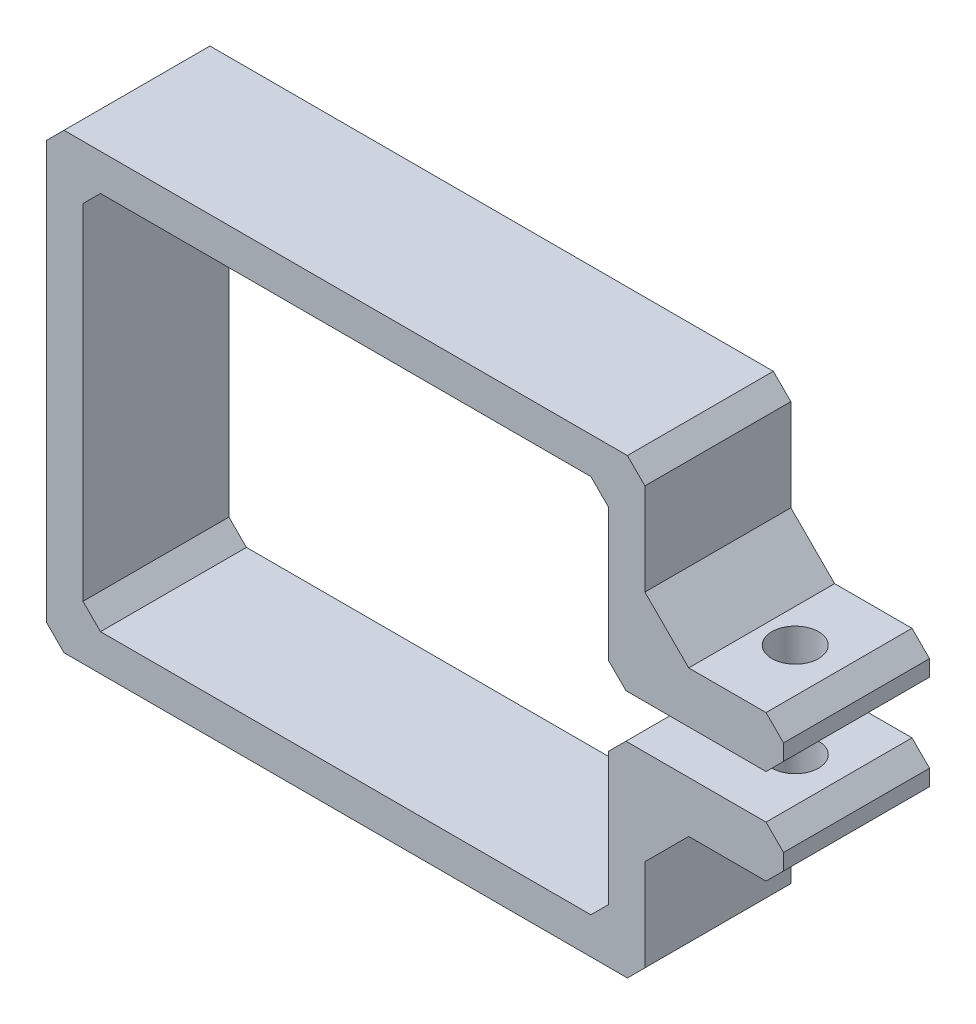
ISO-10303-21;
HEADER;
FILE_DESCRIPTION(('STEP AP214'),'2;1');
FILE_NAME('part.step','',(''),(''),'','','');
FILE_SCHEMA(('AUTOMOTIVE_DESIGN { 1 0 10303 214 1 1 1 1 }'));
ENDSEC;
DATA;
#1=APPLICATION_CONTEXT('core data for automotive mechanical design processes');
#2=APPLICATION_PROTOCOL_DEFINITION('international standard','automotive_design',2000,#1);
#3=PRODUCT_CONTEXT('',#1,'mechanical');
#4=PRODUCT('Part','Part','',(#3));
#5=PRODUCT_RELATED_PRODUCT_CATEGORY('part','',(#4));
#6=PRODUCT_DEFINITION_FORMATION('','',#4);
#7=PRODUCT_DEFINITION_CONTEXT('part definition',#1,'design');
#8=PRODUCT_DEFINITION('design','',#6,#7);
#9=PRODUCT_DEFINITION_SHAPE('','',#8);
#10=(LENGTH_UNIT() NAMED_UNIT(*) SI_UNIT(.MILLI.,.METRE.));
#11=(NAMED_UNIT(*) PLANE_ANGLE_UNIT() SI_UNIT($,.RADIAN.));
#12=(NAMED_UNIT(*) SI_UNIT($,.STERADIAN.) SOLID_ANGLE_UNIT());
#13=UNCERTAINTY_MEASURE_WITH_UNIT(LENGTH_MEASURE(1.E-05),#10,'distance_accuracy_value','');
#14=(GEOMETRIC_REPRESENTATION_CONTEXT(3) GLOBAL_UNCERTAINTY_ASSIGNED_CONTEXT((#13)) GLOBAL_UNIT_ASSIGNED_CONTEXT((#10,
#11,#12)) REPRESENTATION_CONTEXT('',''));
#15=CARTESIAN_POINT('',(0.,0.,0.));
#16=DIRECTION('',(0.,0.,1.));
#17=DIRECTION('',(1.,0.,0.));
#18=AXIS2_PLACEMENT_3D('',#15,#16,#17);
#19=CARTESIAN_POINT('',(0.,5.,10.));
#20=DIRECTION('',(0.,1.,0.));
#21=DIRECTION('',(-1.,0.,0.));
#22=AXIS2_PLACEMENT_3D('',#19,#20,#21);
#23=PLANE('',#22);
#24=CARTESIAN_POINT('',(25.8,5.,5.));
#25=DIRECTION('',(0.,1.,0.));
#26=DIRECTION('',(-1.,0.,0.));
#27=AXIS2_PLACEMENT_3D('',#24,#25,#26);
#28=CIRCLE('',#27,1.6);
#29=CARTESIAN_POINT('',(24.2,5.,5.));
#30=VERTEX_POINT('',#29);
#31=EDGE_CURVE('E516',#30,#30,#28,.T.);
#32=ORIENTED_EDGE('',*,*,#31,.F.);
#33=EDGE_LOOP('',(#32));
#34=FACE_BOUND('',#33,.T.);
#35=DIRECTION('',(1.,0.,0.));
#36=VECTOR('',#35,1.);
#37=CARTESIAN_POINT('',(0.,5.,10.));
#38=LINE('',#37,#36);
#39=CARTESIAN_POINT('',(23.5,5.,10.));
#40=VERTEX_POINT('',#39);
#41=CARTESIAN_POINT('',(28.8,5.,10.));
#42=VERTEX_POINT('',#41);
#43=EDGE_CURVE('E310',#40,#42,#38,.T.);
#44=ORIENTED_EDGE('',*,*,#43,.T.);
#45=DIRECTION('',(0.,0.,-1.));
#46=VECTOR('',#45,1.);
#47=CARTESIAN_POINT('',(28.8,5.,10.));
#48=LINE('',#47,#46);
#49=CARTESIAN_POINT('',(28.8,5.,0.));
#50=VERTEX_POINT('',#49);
#51=EDGE_CURVE('E384',#42,#50,#48,.T.);
#52=ORIENTED_EDGE('',*,*,#51,.T.);
#53=DIRECTION('',(1.,0.,0.));
#54=VECTOR('',#53,1.);
#55=CARTESIAN_POINT('',(0.,5.,0.));
#56=LINE('',#55,#54);
#57=CARTESIAN_POINT('',(23.5,5.,0.));
#58=VERTEX_POINT('',#57);
#59=EDGE_CURVE('E467',#58,#50,#56,.T.);
#60=ORIENTED_EDGE('',*,*,#59,.F.);
#61=DIRECTION('',(0.,0.,1.));
#62=VECTOR('',#61,1.);
#63=CARTESIAN_POINT('',(23.5,5.,10.));
#64=LINE('',#63,#62);
#65=EDGE_CURVE('E263',#58,#40,#64,.T.);
#66=ORIENTED_EDGE('',*,*,#65,.T.);
#67=EDGE_LOOP('',(#44,#52,#60,#66));
#68=FACE_BOUND('',#67,.T.);
#69=ADVANCED_FACE('F41',(#34,#68),#23,.T.);
#70=CARTESIAN_POINT('',(20.5,0.,10.));
#71=DIRECTION('',(1.,0.,0.));
#72=DIRECTION('',(0.,0.,-1.));
#73=AXIS2_PLACEMENT_3D('',#70,#71,#72);
#74=PLANE('',#73);
#75=DIRECTION('',(0.,-1.,0.));
#76=VECTOR('',#75,1.);
#77=CARTESIAN_POINT('',(20.5,0.,0.));
#78=LINE('',#77,#76);
#79=CARTESIAN_POINT('',(20.5,14.3,0.));
#80=VERTEX_POINT('',#79);
#81=CARTESIAN_POINT('',(20.5,8.00000000000003,0.));
#82=VERTEX_POINT('',#81);
#83=EDGE_CURVE('E286',#80,#82,#78,.T.);
#84=ORIENTED_EDGE('',*,*,#83,.F.);
#85=DIRECTION('',(0.,0.,1.));
#86=VECTOR('',#85,1.);
#87=CARTESIAN_POINT('',(20.5,14.3,10.));
#88=LINE('',#87,#86);
#89=CARTESIAN_POINT('',(20.5,14.3,10.));
#90=VERTEX_POINT('',#89);
#91=EDGE_CURVE('E392',#80,#90,#88,.T.);
#92=ORIENTED_EDGE('',*,*,#91,.T.);
#93=DIRECTION('',(0.,-1.,0.));
#94=VECTOR('',#93,1.);
#95=CARTESIAN_POINT('',(20.5,0.,10.));
#96=LINE('',#95,#94);
#97=CARTESIAN_POINT('',(20.5,8.00000000000003,10.));
#98=VERTEX_POINT('',#97);
#99=EDGE_CURVE('E498',#90,#98,#96,.T.);
#100=ORIENTED_EDGE('',*,*,#99,.T.);
#101=DIRECTION('',(0.,0.,-1.));
#102=VECTOR('',#101,1.);
#103=CARTESIAN_POINT('',(20.5,8.00000000000003,0.));
#104=LINE('',#103,#102);
#105=EDGE_CURVE('E313',#98,#82,#104,.T.);
#106=ORIENTED_EDGE('',*,*,#105,.T.);
#107=EDGE_LOOP('',(#84,#92,#100,#106));
#108=FACE_BOUND('',#107,.T.);
#109=ADVANCED_FACE('F543',(#108),#74,.T.);
#110=CARTESIAN_POINT('',(0.,15.5,10.));
#111=DIRECTION('',(0.,1.,0.));
#112=DIRECTION('',(0.,0.,1.));
#113=AXIS2_PLACEMENT_3D('',#110,#111,#112);
#114=PLANE('',#113);
#115=DIRECTION('',(1.,0.,0.));
#116=VECTOR('',#115,1.);
#117=CARTESIAN_POINT('',(0.,15.5,10.));
#118=LINE('',#117,#116);
#119=CARTESIAN_POINT('',(-19.3,15.5,10.));
#120=VERTEX_POINT('',#119);
#121=CARTESIAN_POINT('',(19.3,15.5,10.));
#122=VERTEX_POINT('',#121);
#123=EDGE_CURVE('E505',#120,#122,#118,.T.);
#124=ORIENTED_EDGE('',*,*,#123,.T.);
#125=DIRECTION('',(0.,0.,-1.));
#126=VECTOR('',#125,1.);
#127=CARTESIAN_POINT('',(19.3,15.5,10.));
#128=LINE('',#127,#126);
#129=CARTESIAN_POINT('',(19.3,15.5,0.));
#130=VERTEX_POINT('',#129);
#131=EDGE_CURVE('E389',#122,#130,#128,.T.);
#132=ORIENTED_EDGE('',*,*,#131,.T.);
#133=DIRECTION('',(1.,0.,0.));
#134=VECTOR('',#133,1.);
#135=CARTESIAN_POINT('',(0.,15.5,0.));
#136=LINE('',#135,#134);
#137=CARTESIAN_POINT('',(-19.3,15.5,0.));
#138=VERTEX_POINT('',#137);
#139=EDGE_CURVE('E471',#138,#130,#136,.T.);
#140=ORIENTED_EDGE('',*,*,#139,.F.);
#141=DIRECTION('',(0.,0.,1.));
#142=VECTOR('',#141,1.);
#143=CARTESIAN_POINT('',(-19.3,15.5,10.));
#144=LINE('',#143,#142);
#145=EDGE_CURVE('E387',#138,#120,#144,.T.);
#146=ORIENTED_EDGE('',*,*,#145,.T.);
#147=EDGE_LOOP('',(#124,#132,#140,#146));
#148=FACE_BOUND('',#147,.T.);
#149=ADVANCED_FACE('F549',(#148),#114,.T.);
#150=CARTESIAN_POINT('',(-20.5,0.,10.));
#151=DIRECTION('',(1.,0.,0.));
#152=DIRECTION('',(0.,1.,0.));
#153=AXIS2_PLACEMENT_3D('',#150,#151,#152);
#154=PLANE('',#153);
#155=DIRECTION('',(0.,-1.,0.));
#156=VECTOR('',#155,1.);
#157=CARTESIAN_POINT('',(-20.5,0.,0.));
#158=LINE('',#157,#156);
#159=CARTESIAN_POINT('',(-20.5,14.3,0.));
#160=VERTEX_POINT('',#159);
#161=CARTESIAN_POINT('',(-20.5,-14.3,0.));
#162=VERTEX_POINT('',#161);
#163=EDGE_CURVE('E473',#160,#162,#158,.T.);
#164=ORIENTED_EDGE('',*,*,#163,.T.);
#165=DIRECTION('',(0.,0.,1.));
#166=VECTOR('',#165,1.);
#167=CARTESIAN_POINT('',(-20.5,-14.3,10.));
#168=LINE('',#167,#166);
#169=CARTESIAN_POINT('',(-20.5,-14.3,10.));
#170=VERTEX_POINT('',#169);
#171=EDGE_CURVE('E405',#162,#170,#168,.T.);
#172=ORIENTED_EDGE('',*,*,#171,.T.);
#173=DIRECTION('',(0.,-1.,0.));
#174=VECTOR('',#173,1.);
#175=CARTESIAN_POINT('',(-20.5,0.,10.));
#176=LINE('',#175,#174);
#177=CARTESIAN_POINT('',(-20.5,14.3,10.));
#178=VERTEX_POINT('',#177);
#179=EDGE_CURVE('E501',#178,#170,#176,.T.);
#180=ORIENTED_EDGE('',*,*,#179,.F.);
#181=DIRECTION('',(0.,0.,-1.));
#182=VECTOR('',#181,1.);
#183=CARTESIAN_POINT('',(-20.5,14.3,0.));
#184=LINE('',#183,#182);
#185=EDGE_CURVE('E402',#178,#160,#184,.T.);
#186=ORIENTED_EDGE('',*,*,#185,.T.);
#187=EDGE_LOOP('',(#164,#172,#180,#186));
#188=FACE_BOUND('',#187,.T.);
#189=ADVANCED_FACE('F712',(#188),#154,.F.);
#190=CARTESIAN_POINT('',(0.,-15.5,10.));
#191=DIRECTION('',(0.,1.,0.));
#192=DIRECTION('',(0.,0.,1.));
#193=AXIS2_PLACEMENT_3D('',#190,#191,#192);
#194=PLANE('',#193);
#195=DIRECTION('',(1.,0.,0.));
#196=VECTOR('',#195,1.);
#197=CARTESIAN_POINT('',(0.,-15.5,0.));
#198=LINE('',#197,#196);
#199=CARTESIAN_POINT('',(-19.3,-15.5,0.));
#200=VERTEX_POINT('',#199);
#201=CARTESIAN_POINT('',(19.3,-15.5,0.));
#202=VERTEX_POINT('',#201);
#203=EDGE_CURVE('E284',#200,#202,#198,.T.);
#204=ORIENTED_EDGE('',*,*,#203,.T.);
#205=DIRECTION('',(0.,0.,1.));
#206=VECTOR('',#205,1.);
#207=CARTESIAN_POINT('',(19.3,-15.5,10.));
#208=LINE('',#207,#206);
#209=CARTESIAN_POINT('',(19.3,-15.5,10.));
#210=VERTEX_POINT('',#209);
#211=EDGE_CURVE('E400',#202,#210,#208,.T.);
#212=ORIENTED_EDGE('',*,*,#211,.T.);
#213=DIRECTION('',(1.,0.,0.));
#214=VECTOR('',#213,1.);
#215=CARTESIAN_POINT('',(0.,-15.5,10.));
#216=LINE('',#215,#214);
#217=CARTESIAN_POINT('',(-19.3,-15.5,10.));
#218=VERTEX_POINT('',#217);
#219=EDGE_CURVE('E494',#218,#210,#216,.T.);
#220=ORIENTED_EDGE('',*,*,#219,.F.);
#221=DIRECTION('',(0.,0.,-1.));
#222=VECTOR('',#221,1.);
#223=CARTESIAN_POINT('',(-19.3,-15.5,10.));
#224=LINE('',#223,#222);
#225=EDGE_CURVE('E397',#218,#200,#224,.T.);
#226=ORIENTED_EDGE('',*,*,#225,.T.);
#227=EDGE_LOOP('',(#204,#212,#220,#226));
#228=FACE_BOUND('',#227,.T.);
#229=ADVANCED_FACE('F482',(#228),#194,.F.);
#230=CARTESIAN_POINT('',(20.5,-7.99999999999999,10.));
#231=VERTEX_POINT('',#230);
#232=CARTESIAN_POINT('',(20.5,-14.3,10.));
#233=VERTEX_POINT('',#232);
#234=EDGE_CURVE('E493',#231,#233,#96,.T.);
#235=ORIENTED_EDGE('',*,*,#234,.T.);
#236=DIRECTION('',(0.,0.,-1.));
#237=VECTOR('',#236,1.);
#238=CARTESIAN_POINT('',(20.5,-14.3,0.));
#239=LINE('',#238,#237);
#240=CARTESIAN_POINT('',(20.5,-14.3,0.));
#241=VERTEX_POINT('',#240);
#242=EDGE_CURVE('E394',#233,#241,#239,.T.);
#243=ORIENTED_EDGE('',*,*,#242,.T.);
#244=CARTESIAN_POINT('',(20.5,-7.99999999999999,0.));
#245=VERTEX_POINT('',#244);
#246=EDGE_CURVE('E280',#245,#241,#78,.T.);
#247=ORIENTED_EDGE('',*,*,#246,.F.);
#248=DIRECTION('',(0.,0.,1.));
#249=VECTOR('',#248,1.);
#250=CARTESIAN_POINT('',(20.5,-7.99999999999999,10.));
#251=LINE('',#250,#249);
#252=EDGE_CURVE('E257',#245,#231,#251,.T.);
#253=ORIENTED_EDGE('',*,*,#252,.T.);
#254=EDGE_LOOP('',(#235,#243,#247,#253));
#255=FACE_BOUND('',#254,.T.);
#256=ADVANCED_FACE('F496',(#255),#74,.T.);
#257=CARTESIAN_POINT('',(0.,-5.,10.));
#258=DIRECTION('',(0.,1.,0.));
#259=DIRECTION('',(0.,0.,1.));
#260=AXIS2_PLACEMENT_3D('',#257,#258,#259);
#261=PLANE('',#260);
#262=CARTESIAN_POINT('',(25.8,-5.,5.));
#263=DIRECTION('',(0.,1.,0.));
#264=DIRECTION('',(-1.,0.,0.));
#265=AXIS2_PLACEMENT_3D('',#262,#263,#264);
#266=CIRCLE('',#265,1.6);
#267=CARTESIAN_POINT('',(24.2,-5.,5.));
#268=VERTEX_POINT('',#267);
#269=EDGE_CURVE('E519',#268,#268,#266,.T.);
#270=ORIENTED_EDGE('',*,*,#269,.T.);
#271=EDGE_LOOP('',(#270));
#272=FACE_BOUND('',#271,.T.);
#273=DIRECTION('',(1.,0.,0.));
#274=VECTOR('',#273,1.);
#275=CARTESIAN_POINT('',(0.,-5.,0.));
#276=LINE('',#275,#274);
#277=CARTESIAN_POINT('',(23.5,-5.,0.));
#278=VERTEX_POINT('',#277);
#279=CARTESIAN_POINT('',(28.8,-5.,0.));
#280=VERTEX_POINT('',#279);
#281=EDGE_CURVE('E269',#278,#280,#276,.T.);
#282=ORIENTED_EDGE('',*,*,#281,.T.);
#283=DIRECTION('',(0.,0.,1.));
#284=VECTOR('',#283,1.);
#285=CARTESIAN_POINT('',(28.8,-5.,10.));
#286=LINE('',#285,#284);
#287=CARTESIAN_POINT('',(28.8,-5.,10.));
#288=VERTEX_POINT('',#287);
#289=EDGE_CURVE('E382',#280,#288,#286,.T.);
#290=ORIENTED_EDGE('',*,*,#289,.T.);
#291=DIRECTION('',(1.,0.,0.));
#292=VECTOR('',#291,1.);
#293=CARTESIAN_POINT('',(0.,-5.,10.));
#294=LINE('',#293,#292);
#295=CARTESIAN_POINT('',(23.5,-5.,10.));
#296=VERTEX_POINT('',#295);
#297=EDGE_CURVE('E272',#296,#288,#294,.T.);
#298=ORIENTED_EDGE('',*,*,#297,.F.);
#299=DIRECTION('',(0.,0.,-1.));
#300=VECTOR('',#299,1.);
#301=CARTESIAN_POINT('',(23.5,-5.,10.));
#302=LINE('',#301,#300);
#303=EDGE_CURVE('E256',#296,#278,#302,.T.);
#304=ORIENTED_EDGE('',*,*,#303,.T.);
#305=EDGE_LOOP('',(#282,#290,#298,#304));
#306=FACE_BOUND('',#305,.T.);
#307=ADVANCED_FACE('F268',(#272,#306),#261,.F.);
#308=CARTESIAN_POINT('',(30.,0.,10.));
#309=DIRECTION('',(1.,0.,0.));
#310=DIRECTION('',(0.,0.,-1.));
#311=AXIS2_PLACEMENT_3D('',#308,#309,#310);
#312=PLANE('',#311);
#313=DIRECTION('',(0.,-1.,0.));
#314=VECTOR('',#313,1.);
#315=CARTESIAN_POINT('',(30.,0.,0.));
#316=LINE('',#315,#314);
#317=CARTESIAN_POINT('',(30.,-2.7,0.));
#318=VERTEX_POINT('',#317);
#319=CARTESIAN_POINT('',(30.,-3.80000000000001,0.));
#320=VERTEX_POINT('',#319);
#321=EDGE_CURVE('E279',#318,#320,#316,.T.);
#322=ORIENTED_EDGE('',*,*,#321,.F.);
#323=DIRECTION('',(0.,0.,1.));
#324=VECTOR('',#323,1.);
#325=CARTESIAN_POINT('',(30.,-2.7,10.));
#326=LINE('',#325,#324);
#327=CARTESIAN_POINT('',(30.,-2.7,10.));
#328=VERTEX_POINT('',#327);
#329=EDGE_CURVE('E380',#318,#328,#326,.T.);
#330=ORIENTED_EDGE('',*,*,#329,.T.);
#331=DIRECTION('',(0.,-1.,0.));
#332=VECTOR('',#331,1.);
#333=CARTESIAN_POINT('',(30.,0.,10.));
#334=LINE('',#333,#332);
#335=CARTESIAN_POINT('',(30.,-3.80000000000001,10.));
#336=VERTEX_POINT('',#335);
#337=EDGE_CURVE('E499',#328,#336,#334,.T.);
#338=ORIENTED_EDGE('',*,*,#337,.T.);
#339=DIRECTION('',(0.,0.,-1.));
#340=VECTOR('',#339,1.);
#341=CARTESIAN_POINT('',(30.,-3.80000000000001,0.));
#342=LINE('',#341,#340);
#343=EDGE_CURVE('E377',#336,#320,#342,.T.);
#344=ORIENTED_EDGE('',*,*,#343,.T.);
#345=EDGE_LOOP('',(#322,#330,#338,#344));
#346=FACE_BOUND('',#345,.T.);
#347=ADVANCED_FACE('F696',(#346),#312,.T.);
#348=CARTESIAN_POINT('',(0.,-1.5,10.));
#349=DIRECTION('',(0.,1.,0.));
#350=DIRECTION('',(0.,0.,1.));
#351=AXIS2_PLACEMENT_3D('',#348,#349,#350);
#352=PLANE('',#351);
#353=CARTESIAN_POINT('',(25.8,-1.5,5.));
#354=DIRECTION('',(0.,1.,0.));
#355=DIRECTION('',(0.,0.,1.));
#356=AXIS2_PLACEMENT_3D('',#353,#354,#355);
#357=CIRCLE('',#356,1.6);
#358=CARTESIAN_POINT('',(25.8,-1.5,6.6));
#359=VERTEX_POINT('',#358);
#360=EDGE_CURVE('E469',#359,#359,#357,.T.);
#361=ORIENTED_EDGE('',*,*,#360,.F.);
#362=EDGE_LOOP('',(#361));
#363=FACE_BOUND('',#362,.T.);
#364=DIRECTION('',(1.,0.,0.));
#365=VECTOR('',#364,1.);
#366=CARTESIAN_POINT('',(0.,-1.5,10.));
#367=LINE('',#366,#365);
#368=CARTESIAN_POINT('',(19.2,-1.5,10.));
#369=VERTEX_POINT('',#368);
#370=CARTESIAN_POINT('',(28.8,-1.5,10.));
#371=VERTEX_POINT('',#370);
#372=EDGE_CURVE('E662',#369,#371,#367,.T.);
#373=ORIENTED_EDGE('',*,*,#372,.T.);
#374=DIRECTION('',(0.,0.,-1.));
#375=VECTOR('',#374,1.);
#376=CARTESIAN_POINT('',(28.8,-1.5,10.));
#377=LINE('',#376,#375);
#378=CARTESIAN_POINT('',(28.8,-1.5,0.));
#379=VERTEX_POINT('',#378);
#380=EDGE_CURVE('E374',#371,#379,#377,.T.);
#381=ORIENTED_EDGE('',*,*,#380,.T.);
#382=DIRECTION('',(1.,0.,0.));
#383=VECTOR('',#382,1.);
#384=CARTESIAN_POINT('',(0.,-1.5,0.));
#385=LINE('',#384,#383);
#386=CARTESIAN_POINT('',(19.2,-1.5,0.));
#387=VERTEX_POINT('',#386);
#388=EDGE_CURVE('E282',#387,#379,#385,.T.);
#389=ORIENTED_EDGE('',*,*,#388,.F.);
#390=DIRECTION('',(0.,0.,1.));
#391=VECTOR('',#390,1.);
#392=CARTESIAN_POINT('',(19.2,-1.5,10.));
#393=LINE('',#392,#391);
#394=EDGE_CURVE('E372',#387,#369,#393,.T.);
#395=ORIENTED_EDGE('',*,*,#394,.T.);
#396=EDGE_LOOP('',(#373,#381,#389,#395));
#397=FACE_BOUND('',#396,.T.);
#398=ADVANCED_FACE('F690',(#363,#397),#352,.T.);
#399=CARTESIAN_POINT('',(18.,0.,10.));
#400=DIRECTION('',(1.,0.,0.));
#401=DIRECTION('',(0.,0.,-1.));
#402=AXIS2_PLACEMENT_3D('',#399,#400,#401);
#403=PLANE('',#402);
#404=DIRECTION('',(0.,-1.,0.));
#405=VECTOR('',#404,1.);
#406=CARTESIAN_POINT('',(18.,0.,0.));
#407=LINE('',#406,#405);
#408=CARTESIAN_POINT('',(18.,-2.69999999999999,0.));
#409=VERTEX_POINT('',#408);
#410=CARTESIAN_POINT('',(18.,-11.8,0.));
#411=VERTEX_POINT('',#410);
#412=EDGE_CURVE('E292',#409,#411,#407,.T.);
#413=ORIENTED_EDGE('',*,*,#412,.T.);
#414=DIRECTION('',(0.,0.,1.));
#415=VECTOR('',#414,1.);
#416=CARTESIAN_POINT('',(18.,-11.8,10.));
#417=LINE('',#416,#415);
#418=CARTESIAN_POINT('',(18.,-11.8,10.));
#419=VERTEX_POINT('',#418);
#420=EDGE_CURVE('E415',#411,#419,#417,.T.);
#421=ORIENTED_EDGE('',*,*,#420,.T.);
#422=DIRECTION('',(0.,-1.,0.));
#423=VECTOR('',#422,1.);
#424=CARTESIAN_POINT('',(18.,0.,10.));
#425=LINE('',#424,#423);
#426=CARTESIAN_POINT('',(18.,-2.69999999999999,10.));
#427=VERTEX_POINT('',#426);
#428=EDGE_CURVE('E659',#427,#419,#425,.T.);
#429=ORIENTED_EDGE('',*,*,#428,.F.);
#430=DIRECTION('',(0.,0.,-1.));
#431=VECTOR('',#430,1.);
#432=CARTESIAN_POINT('',(18.,-2.69999999999999,0.));
#433=LINE('',#432,#431);
#434=EDGE_CURVE('E412',#427,#409,#433,.T.);
#435=ORIENTED_EDGE('',*,*,#434,.T.);
#436=EDGE_LOOP('',(#413,#421,#429,#435));
#437=FACE_BOUND('',#436,.T.);
#438=ADVANCED_FACE('F664',(#437),#403,.F.);
#439=CARTESIAN_POINT('',(0.,-13.,10.));
#440=DIRECTION('',(0.,1.,0.));
#441=DIRECTION('',(0.,0.,1.));
#442=AXIS2_PLACEMENT_3D('',#439,#440,#441);
#443=PLANE('',#442);
#444=DIRECTION('',(1.,0.,0.));
#445=VECTOR('',#444,1.);
#446=CARTESIAN_POINT('',(0.,-13.,10.));
#447=LINE('',#446,#445);
#448=CARTESIAN_POINT('',(-16.8,-13.,10.));
#449=VERTEX_POINT('',#448);
#450=CARTESIAN_POINT('',(16.8,-13.,10.));
#451=VERTEX_POINT('',#450);
#452=EDGE_CURVE('E667',#449,#451,#447,.T.);
#453=ORIENTED_EDGE('',*,*,#452,.T.);
#454=DIRECTION('',(0.,0.,-1.));
#455=VECTOR('',#454,1.);
#456=CARTESIAN_POINT('',(16.8,-13.,10.));
#457=LINE('',#456,#455);
#458=CARTESIAN_POINT('',(16.8,-13.,0.));
#459=VERTEX_POINT('',#458);
#460=EDGE_CURVE('E409',#451,#459,#457,.T.);
#461=ORIENTED_EDGE('',*,*,#460,.T.);
#462=DIRECTION('',(1.,0.,0.));
#463=VECTOR('',#462,1.);
#464=CARTESIAN_POINT('',(0.,-13.,0.));
#465=LINE('',#464,#463);
#466=CARTESIAN_POINT('',(-16.8,-13.,0.));
#467=VERTEX_POINT('',#466);
#468=EDGE_CURVE('E295',#467,#459,#465,.T.);
#469=ORIENTED_EDGE('',*,*,#468,.F.);
#470=DIRECTION('',(0.,0.,1.));
#471=VECTOR('',#470,1.);
#472=CARTESIAN_POINT('',(-16.8,-13.,10.));
#473=LINE('',#472,#471);
#474=EDGE_CURVE('E407',#467,#449,#473,.T.);
#475=ORIENTED_EDGE('',*,*,#474,.T.);
#476=EDGE_LOOP('',(#453,#461,#469,#475));
#477=FACE_BOUND('',#476,.T.);
#478=ADVANCED_FACE('F685',(#477),#443,.T.);
#479=CARTESIAN_POINT('',(-18.,0.,10.));
#480=DIRECTION('',(1.,0.,0.));
#481=DIRECTION('',(0.,0.,-1.));
#482=AXIS2_PLACEMENT_3D('',#479,#480,#481);
#483=PLANE('',#482);
#484=DIRECTION('',(0.,-1.,0.));
#485=VECTOR('',#484,1.);
#486=CARTESIAN_POINT('',(-18.,0.,10.));
#487=LINE('',#486,#485);
#488=CARTESIAN_POINT('',(-18.,11.8,10.));
#489=VERTEX_POINT('',#488);
#490=CARTESIAN_POINT('',(-18.,-11.8,10.));
#491=VERTEX_POINT('',#490);
#492=EDGE_CURVE('E461',#489,#491,#487,.T.);
#493=ORIENTED_EDGE('',*,*,#492,.T.);
#494=DIRECTION('',(0.,0.,-1.));
#495=VECTOR('',#494,1.);
#496=CARTESIAN_POINT('',(-18.,-11.8,0.));
#497=LINE('',#496,#495);
#498=CARTESIAN_POINT('',(-18.,-11.8,0.));
#499=VERTEX_POINT('',#498);
#500=EDGE_CURVE('E419',#491,#499,#497,.T.);
#501=ORIENTED_EDGE('',*,*,#500,.T.);
#502=DIRECTION('',(0.,-1.,0.));
#503=VECTOR('',#502,1.);
#504=CARTESIAN_POINT('',(-18.,0.,0.));
#505=LINE('',#504,#503);
#506=CARTESIAN_POINT('',(-18.,11.8,0.));
#507=VERTEX_POINT('',#506);
#508=EDGE_CURVE('E298',#507,#499,#505,.T.);
#509=ORIENTED_EDGE('',*,*,#508,.F.);
#510=DIRECTION('',(0.,0.,1.));
#511=VECTOR('',#510,1.);
#512=CARTESIAN_POINT('',(-18.,11.8,10.));
#513=LINE('',#512,#511);
#514=EDGE_CURVE('E417',#507,#489,#513,.T.);
#515=ORIENTED_EDGE('',*,*,#514,.T.);
#516=EDGE_LOOP('',(#493,#501,#509,#515));
#517=FACE_BOUND('',#516,.T.);
#518=ADVANCED_FACE('F677',(#517),#483,.T.);
#519=CARTESIAN_POINT('',(0.,13.,10.));
#520=DIRECTION('',(0.,1.,0.));
#521=DIRECTION('',(0.,0.,1.));
#522=AXIS2_PLACEMENT_3D('',#519,#520,#521);
#523=PLANE('',#522);
#524=DIRECTION('',(1.,0.,0.));
#525=VECTOR('',#524,1.);
#526=CARTESIAN_POINT('',(0.,13.,10.));
#527=LINE('',#526,#525);
#528=CARTESIAN_POINT('',(-16.8,13.,10.));
#529=VERTEX_POINT('',#528);
#530=CARTESIAN_POINT('',(16.8,13.,10.));
#531=VERTEX_POINT('',#530);
#532=EDGE_CURVE('E457',#529,#531,#527,.T.);
#533=ORIENTED_EDGE('',*,*,#532,.F.);
#534=DIRECTION('',(0.,0.,-1.));
#535=VECTOR('',#534,1.);
#536=CARTESIAN_POINT('',(-16.8,13.,10.));
#537=LINE('',#536,#535);
#538=CARTESIAN_POINT('',(-16.8,13.,0.));
#539=VERTEX_POINT('',#538);
#540=EDGE_CURVE('E424',#529,#539,#537,.T.);
#541=ORIENTED_EDGE('',*,*,#540,.T.);
#542=DIRECTION('',(1.,0.,0.));
#543=VECTOR('',#542,1.);
#544=CARTESIAN_POINT('',(0.,13.,0.));
#545=LINE('',#544,#543);
#546=CARTESIAN_POINT('',(16.8,13.,0.));
#547=VERTEX_POINT('',#546);
#548=EDGE_CURVE('E301',#539,#547,#545,.T.);
#549=ORIENTED_EDGE('',*,*,#548,.T.);
#550=DIRECTION('',(0.,0.,1.));
#551=VECTOR('',#550,1.);
#552=CARTESIAN_POINT('',(16.8,13.,10.));
#553=LINE('',#552,#551);
#554=EDGE_CURVE('E422',#547,#531,#553,.T.);
#555=ORIENTED_EDGE('',*,*,#554,.T.);
#556=EDGE_LOOP('',(#533,#541,#549,#555));
#557=FACE_BOUND('',#556,.T.);
#558=ADVANCED_FACE('F450',(#557),#523,.F.);
#559=CARTESIAN_POINT('',(18.,0.,10.));
#560=DIRECTION('',(1.,0.,0.));
#561=DIRECTION('',(0.,0.,-1.));
#562=AXIS2_PLACEMENT_3D('',#559,#560,#561);
#563=PLANE('',#562);
#564=DIRECTION('',(0.,-1.,0.));
#565=VECTOR('',#564,1.);
#566=CARTESIAN_POINT('',(18.,0.,10.));
#567=LINE('',#566,#565);
#568=CARTESIAN_POINT('',(18.,11.8,10.));
#569=VERTEX_POINT('',#568);
#570=CARTESIAN_POINT('',(18.,2.7,10.));
#571=VERTEX_POINT('',#570);
#572=EDGE_CURVE('E454',#569,#571,#567,.T.);
#573=ORIENTED_EDGE('',*,*,#572,.F.);
#574=DIRECTION('',(0.,0.,-1.));
#575=VECTOR('',#574,1.);
#576=CARTESIAN_POINT('',(18.,11.8,0.));
#577=LINE('',#576,#575);
#578=CARTESIAN_POINT('',(18.,11.8,0.));
#579=VERTEX_POINT('',#578);
#580=EDGE_CURVE('E428',#569,#579,#577,.T.);
#581=ORIENTED_EDGE('',*,*,#580,.T.);
#582=DIRECTION('',(0.,-1.,0.));
#583=VECTOR('',#582,1.);
#584=CARTESIAN_POINT('',(18.,0.,0.));
#585=LINE('',#584,#583);
#586=CARTESIAN_POINT('',(18.,2.7,0.));
#587=VERTEX_POINT('',#586);
#588=EDGE_CURVE('E304',#579,#587,#585,.T.);
#589=ORIENTED_EDGE('',*,*,#588,.T.);
#590=DIRECTION('',(0.,0.,1.));
#591=VECTOR('',#590,1.);
#592=CARTESIAN_POINT('',(18.,2.7,10.));
#593=LINE('',#592,#591);
#594=EDGE_CURVE('E58',#587,#571,#593,.T.);
#595=ORIENTED_EDGE('',*,*,#594,.T.);
#596=EDGE_LOOP('',(#573,#581,#589,#595));
#597=FACE_BOUND('',#596,.T.);
#598=ADVANCED_FACE('F453',(#597),#563,.F.);
#599=CARTESIAN_POINT('',(0.,1.5,10.));
#600=DIRECTION('',(0.,1.,0.));
#601=DIRECTION('',(0.,0.,1.));
#602=AXIS2_PLACEMENT_3D('',#599,#600,#601);
#603=PLANE('',#602);
#604=CARTESIAN_POINT('',(25.8,1.5,5.));
#605=DIRECTION('',(0.,1.,0.));
#606=DIRECTION('',(0.,0.,1.));
#607=AXIS2_PLACEMENT_3D('',#604,#605,#606);
#608=CIRCLE('',#607,1.6);
#609=CARTESIAN_POINT('',(25.8,1.5,6.6));
#610=VERTEX_POINT('',#609);
#611=EDGE_CURVE('E46',#610,#610,#608,.T.);
#612=ORIENTED_EDGE('',*,*,#611,.T.);
#613=EDGE_LOOP('',(#612));
#614=FACE_BOUND('',#613,.T.);
#615=DIRECTION('',(1.,0.,0.));
#616=VECTOR('',#615,1.);
#617=CARTESIAN_POINT('',(0.,1.5,0.));
#618=LINE('',#617,#616);
#619=CARTESIAN_POINT('',(19.2,1.5,0.));
#620=VERTEX_POINT('',#619);
#621=CARTESIAN_POINT('',(28.8,1.5,0.));
#622=VERTEX_POINT('',#621);
#623=EDGE_CURVE('E306',#620,#622,#618,.T.);
#624=ORIENTED_EDGE('',*,*,#623,.T.);
#625=DIRECTION('',(0.,0.,1.));
#626=VECTOR('',#625,1.);
#627=CARTESIAN_POINT('',(28.8,1.5,10.));
#628=LINE('',#627,#626);
#629=CARTESIAN_POINT('',(28.8,1.5,10.));
#630=VERTEX_POINT('',#629);
#631=EDGE_CURVE('E350',#622,#630,#628,.T.);
#632=ORIENTED_EDGE('',*,*,#631,.T.);
#633=DIRECTION('',(1.,0.,0.));
#634=VECTOR('',#633,1.);
#635=CARTESIAN_POINT('',(0.,1.5,10.));
#636=LINE('',#635,#634);
#637=CARTESIAN_POINT('',(19.2,1.5,10.));
#638=VERTEX_POINT('',#637);
#639=EDGE_CURVE('E456',#638,#630,#636,.T.);
#640=ORIENTED_EDGE('',*,*,#639,.F.);
#641=DIRECTION('',(0.,0.,-1.));
#642=VECTOR('',#641,1.);
#643=CARTESIAN_POINT('',(19.2,1.5,10.));
#644=LINE('',#643,#642);
#645=EDGE_CURVE('E347',#638,#620,#644,.T.);
#646=ORIENTED_EDGE('',*,*,#645,.T.);
#647=EDGE_LOOP('',(#624,#632,#640,#646));
#648=FACE_BOUND('',#647,.T.);
#649=ADVANCED_FACE('F526',(#614,#648),#603,.F.);
#650=CARTESIAN_POINT('',(30.,0.,10.));
#651=DIRECTION('',(1.,0.,0.));
#652=DIRECTION('',(0.,0.,-1.));
#653=AXIS2_PLACEMENT_3D('',#650,#651,#652);
#654=PLANE('',#653);
#655=DIRECTION('',(0.,-1.,0.));
#656=VECTOR('',#655,1.);
#657=CARTESIAN_POINT('',(30.,0.,10.));
#658=LINE('',#657,#656);
#659=CARTESIAN_POINT('',(30.,3.8,10.));
#660=VERTEX_POINT('',#659);
#661=CARTESIAN_POINT('',(30.,2.69999999999999,10.));
#662=VERTEX_POINT('',#661);
#663=EDGE_CURVE('E273',#660,#662,#658,.T.);
#664=ORIENTED_EDGE('',*,*,#663,.T.);
#665=DIRECTION('',(0.,0.,-1.));
#666=VECTOR('',#665,1.);
#667=CARTESIAN_POINT('',(30.,2.69999999999999,0.));
#668=LINE('',#667,#666);
#669=CARTESIAN_POINT('',(30.,2.69999999999999,0.));
#670=VERTEX_POINT('',#669);
#671=EDGE_CURVE('E325',#662,#670,#668,.T.);
#672=ORIENTED_EDGE('',*,*,#671,.T.);
#673=DIRECTION('',(0.,-1.,0.));
#674=VECTOR('',#673,1.);
#675=CARTESIAN_POINT('',(30.,0.,0.));
#676=LINE('',#675,#674);
#677=CARTESIAN_POINT('',(30.,3.8,0.));
#678=VERTEX_POINT('',#677);
#679=EDGE_CURVE('E309',#678,#670,#676,.T.);
#680=ORIENTED_EDGE('',*,*,#679,.F.);
#681=DIRECTION('',(0.,0.,1.));
#682=VECTOR('',#681,1.);
#683=CARTESIAN_POINT('',(30.,3.8,10.));
#684=LINE('',#683,#682);
#685=EDGE_CURVE('E323',#678,#660,#684,.T.);
#686=ORIENTED_EDGE('',*,*,#685,.T.);
#687=EDGE_LOOP('',(#664,#672,#680,#686));
#688=FACE_BOUND('',#687,.T.);
#689=ADVANCED_FACE('F740',(#688),#654,.T.);
#690=CARTESIAN_POINT('',(0.,0.,10.));
#691=DIRECTION('',(0.,0.,1.));
#692=DIRECTION('',(1.,0.,0.));
#693=AXIS2_PLACEMENT_3D('',#690,#691,#692);
#694=PLANE('',#693);
#695=ORIENTED_EDGE('',*,*,#639,.T.);
#696=DIRECTION('',(0.70710678118655,0.707106781186545,0.));
#697=VECTOR('',#696,1.);
#698=CARTESIAN_POINT('',(13.6499999999999,-13.65,10.));
#699=LINE('',#698,#697);
#700=EDGE_CURVE('E370',#630,#662,#699,.T.);
#701=ORIENTED_EDGE('',*,*,#700,.T.);
#702=ORIENTED_EDGE('',*,*,#663,.F.);
#703=DIRECTION('',(0.707106781186545,-0.70710678118655,0.));
#704=VECTOR('',#703,1.);
#705=CARTESIAN_POINT('',(16.9000000000001,16.9,10.));
#706=LINE('',#705,#704);
#707=EDGE_CURVE('E364',#660,#42,#706,.F.);
#708=ORIENTED_EDGE('',*,*,#707,.T.);
#709=ORIENTED_EDGE('',*,*,#43,.F.);
#710=DIRECTION('',(0.707106781186544,-0.707106781186551,0.));
#711=VECTOR('',#710,1.);
#712=CARTESIAN_POINT('',(20.5,8.00000000000003,10.));
#713=LINE('',#712,#711);
#714=EDGE_CURVE('E320',#40,#98,#713,.F.);
#715=ORIENTED_EDGE('',*,*,#714,.T.);
#716=ORIENTED_EDGE('',*,*,#99,.F.);
#717=DIRECTION('',(0.707106781186546,-0.70710678118655,0.));
#718=VECTOR('',#717,1.);
#719=CARTESIAN_POINT('',(17.4000000000001,17.4,10.));
#720=LINE('',#719,#718);
#721=EDGE_CURVE('E362',#90,#122,#720,.F.);
#722=ORIENTED_EDGE('',*,*,#721,.T.);
#723=ORIENTED_EDGE('',*,*,#123,.F.);
#724=DIRECTION('',(-0.70710678118655,-0.707106781186545,0.));
#725=VECTOR('',#724,1.);
#726=CARTESIAN_POINT('',(-17.3999999999999,17.4,10.));
#727=LINE('',#726,#725);
#728=EDGE_CURVE('E356',#120,#178,#727,.T.);
#729=ORIENTED_EDGE('',*,*,#728,.T.);
#730=ORIENTED_EDGE('',*,*,#179,.T.);
#731=DIRECTION('',(-0.707106781186545,0.70710678118655,0.));
#732=VECTOR('',#731,1.);
#733=CARTESIAN_POINT('',(-17.4000000000001,-17.4,10.));
#734=LINE('',#733,#732);
#735=EDGE_CURVE('E358',#170,#218,#734,.F.);
#736=ORIENTED_EDGE('',*,*,#735,.T.);
#737=ORIENTED_EDGE('',*,*,#219,.T.);
#738=DIRECTION('',(0.70710678118655,0.707106781186545,0.));
#739=VECTOR('',#738,1.);
#740=CARTESIAN_POINT('',(17.3999999999999,-17.4,10.));
#741=LINE('',#740,#739);
#742=EDGE_CURVE('E360',#210,#233,#741,.T.);
#743=ORIENTED_EDGE('',*,*,#742,.T.);
#744=ORIENTED_EDGE('',*,*,#234,.F.);
#745=DIRECTION('',(0.707106781186552,0.707106781186544,0.));
#746=VECTOR('',#745,1.);
#747=CARTESIAN_POINT('',(23.5,-5.,10.));
#748=LINE('',#747,#746);
#749=EDGE_CURVE('E262',#231,#296,#748,.T.);
#750=ORIENTED_EDGE('',*,*,#749,.T.);
#751=ORIENTED_EDGE('',*,*,#297,.T.);
#752=DIRECTION('',(0.70710678118655,0.707106781186545,0.));
#753=VECTOR('',#752,1.);
#754=CARTESIAN_POINT('',(16.8999999999999,-16.9,10.));
#755=LINE('',#754,#753);
#756=EDGE_CURVE('E366',#288,#336,#755,.T.);
#757=ORIENTED_EDGE('',*,*,#756,.T.);
#758=ORIENTED_EDGE('',*,*,#337,.F.);
#759=DIRECTION('',(0.707106781186546,-0.70710678118655,0.));
#760=VECTOR('',#759,1.);
#761=CARTESIAN_POINT('',(13.6500000000001,13.65,10.));
#762=LINE('',#761,#760);
#763=EDGE_CURVE('E368',#328,#371,#762,.F.);
#764=ORIENTED_EDGE('',*,*,#763,.T.);
#765=ORIENTED_EDGE('',*,*,#372,.F.);
#766=DIRECTION('',(-0.70710678118655,-0.707106781186545,0.));
#767=VECTOR('',#766,1.);
#768=CARTESIAN_POINT('',(10.3499999999999,-10.35,10.));
#769=LINE('',#768,#767);
#770=EDGE_CURVE('E354',#369,#427,#769,.T.);
#771=ORIENTED_EDGE('',*,*,#770,.T.);
#772=ORIENTED_EDGE('',*,*,#428,.T.);
#773=DIRECTION('',(-0.70710678118655,-0.707106781186546,0.));
#774=VECTOR('',#773,1.);
#775=CARTESIAN_POINT('',(16.8,-13.,10.));
#776=LINE('',#775,#774);
#777=EDGE_CURVE('E433',#419,#451,#776,.T.);
#778=ORIENTED_EDGE('',*,*,#777,.T.);
#779=ORIENTED_EDGE('',*,*,#452,.F.);
#780=DIRECTION('',(0.707106781186546,-0.70710678118655,0.));
#781=VECTOR('',#780,1.);
#782=CARTESIAN_POINT('',(-18.,-11.8,10.));
#783=LINE('',#782,#781);
#784=EDGE_CURVE('E437',#449,#491,#783,.F.);
#785=ORIENTED_EDGE('',*,*,#784,.T.);
#786=ORIENTED_EDGE('',*,*,#492,.F.);
#787=DIRECTION('',(0.707106781186552,0.707106781186544,0.));
#788=VECTOR('',#787,1.);
#789=CARTESIAN_POINT('',(-16.8,13.,10.));
#790=LINE('',#789,#788);
#791=EDGE_CURVE('E441',#489,#529,#790,.T.);
#792=ORIENTED_EDGE('',*,*,#791,.T.);
#793=ORIENTED_EDGE('',*,*,#532,.T.);
#794=DIRECTION('',(-0.707106781186546,0.70710678118655,0.));
#795=VECTOR('',#794,1.);
#796=CARTESIAN_POINT('',(18.,11.8,10.));
#797=LINE('',#796,#795);
#798=EDGE_CURVE('E11',#531,#569,#797,.F.);
#799=ORIENTED_EDGE('',*,*,#798,.T.);
#800=ORIENTED_EDGE('',*,*,#572,.T.);
#801=DIRECTION('',(-0.707106781186545,0.70710678118655,0.));
#802=VECTOR('',#801,1.);
#803=CARTESIAN_POINT('',(10.35,10.35,10.));
#804=LINE('',#803,#802);
#805=EDGE_CURVE('E352',#571,#638,#804,.F.);
#806=ORIENTED_EDGE('',*,*,#805,.T.);
#807=EDGE_LOOP('',(#695,#701,#702,#708,#709,#715,#716,#722,#723,#729,#730,#736,#737,#743,#744,
#750,#751,#757,#758,#764,#765,#771,#772,#778,#779,#785,#786,#792,#793,#799,#800,#806));
#808=FACE_BOUND('',#807,.T.);
#809=ADVANCED_FACE('F492',(#808),#694,.T.);
#810=CARTESIAN_POINT('',(0.,0.,0.));
#811=DIRECTION('',(0.,0.,1.));
#812=DIRECTION('',(1.,0.,0.));
#813=AXIS2_PLACEMENT_3D('',#810,#811,#812);
#814=PLANE('',#813);
#815=ORIENTED_EDGE('',*,*,#679,.T.);
#816=DIRECTION('',(-0.70710678118655,-0.707106781186545,0.));
#817=VECTOR('',#816,1.);
#818=CARTESIAN_POINT('',(30.,2.69999999999999,0.));
#819=LINE('',#818,#817);
#820=EDGE_CURVE('E345',#670,#622,#819,.T.);
#821=ORIENTED_EDGE('',*,*,#820,.T.);
#822=ORIENTED_EDGE('',*,*,#623,.F.);
#823=DIRECTION('',(0.707106781186545,-0.70710678118655,0.));
#824=VECTOR('',#823,1.);
#825=CARTESIAN_POINT('',(19.2,1.5,0.));
#826=LINE('',#825,#824);
#827=EDGE_CURVE('E328',#620,#587,#826,.F.);
#828=ORIENTED_EDGE('',*,*,#827,.T.);
#829=ORIENTED_EDGE('',*,*,#588,.F.);
#830=DIRECTION('',(0.707106781186546,-0.70710678118655,0.));
#831=VECTOR('',#830,1.);
#832=CARTESIAN_POINT('',(14.9,14.9,0.));
#833=LINE('',#832,#831);
#834=EDGE_CURVE('E51',#579,#547,#833,.F.);
#835=ORIENTED_EDGE('',*,*,#834,.T.);
#836=ORIENTED_EDGE('',*,*,#548,.F.);
#837=DIRECTION('',(-0.707106781186552,-0.707106781186544,0.));
#838=VECTOR('',#837,1.);
#839=CARTESIAN_POINT('',(-14.8999999999999,14.9000000000001,0.));
#840=LINE('',#839,#838);
#841=EDGE_CURVE('E439',#539,#507,#840,.T.);
#842=ORIENTED_EDGE('',*,*,#841,.T.);
#843=ORIENTED_EDGE('',*,*,#508,.T.);
#844=DIRECTION('',(-0.707106781186546,0.70710678118655,0.));
#845=VECTOR('',#844,1.);
#846=CARTESIAN_POINT('',(-14.9000000000001,-14.9,0.));
#847=LINE('',#846,#845);
#848=EDGE_CURVE('E435',#499,#467,#847,.F.);
#849=ORIENTED_EDGE('',*,*,#848,.T.);
#850=ORIENTED_EDGE('',*,*,#468,.T.);
#851=DIRECTION('',(0.70710678118655,0.707106781186546,0.));
#852=VECTOR('',#851,1.);
#853=CARTESIAN_POINT('',(14.8999999999999,-14.9,0.));
#854=LINE('',#853,#852);
#855=EDGE_CURVE('E431',#459,#411,#854,.T.);
#856=ORIENTED_EDGE('',*,*,#855,.T.);
#857=ORIENTED_EDGE('',*,*,#412,.F.);
#858=DIRECTION('',(0.70710678118655,0.707106781186545,0.));
#859=VECTOR('',#858,1.);
#860=CARTESIAN_POINT('',(18.,-2.69999999999999,0.));
#861=LINE('',#860,#859);
#862=EDGE_CURVE('E330',#409,#387,#861,.T.);
#863=ORIENTED_EDGE('',*,*,#862,.T.);
#864=ORIENTED_EDGE('',*,*,#388,.T.);
#865=DIRECTION('',(-0.707106781186546,0.70710678118655,0.));
#866=VECTOR('',#865,1.);
#867=CARTESIAN_POINT('',(28.8,-1.5,0.));
#868=LINE('',#867,#866);
#869=EDGE_CURVE('E343',#379,#318,#868,.F.);
#870=ORIENTED_EDGE('',*,*,#869,.T.);
#871=ORIENTED_EDGE('',*,*,#321,.T.);
#872=DIRECTION('',(-0.70710678118655,-0.707106781186545,0.));
#873=VECTOR('',#872,1.);
#874=CARTESIAN_POINT('',(30.,-3.80000000000001,0.));
#875=LINE('',#874,#873);
#876=EDGE_CURVE('E278',#320,#280,#875,.T.);
#877=ORIENTED_EDGE('',*,*,#876,.T.);
#878=ORIENTED_EDGE('',*,*,#281,.F.);
#879=DIRECTION('',(-0.707106781186552,-0.707106781186544,0.));
#880=VECTOR('',#879,1.);
#881=CARTESIAN_POINT('',(14.2499999999999,-14.25,0.));
#882=LINE('',#881,#880);
#883=EDGE_CURVE('E252',#278,#245,#882,.T.);
#884=ORIENTED_EDGE('',*,*,#883,.T.);
#885=ORIENTED_EDGE('',*,*,#246,.T.);
#886=DIRECTION('',(-0.70710678118655,-0.707106781186545,0.));
#887=VECTOR('',#886,1.);
#888=CARTESIAN_POINT('',(20.5,-14.3,0.));
#889=LINE('',#888,#887);
#890=EDGE_CURVE('E336',#241,#202,#889,.T.);
#891=ORIENTED_EDGE('',*,*,#890,.T.);
#892=ORIENTED_EDGE('',*,*,#203,.F.);
#893=DIRECTION('',(0.707106781186545,-0.70710678118655,0.));
#894=VECTOR('',#893,1.);
#895=CARTESIAN_POINT('',(-19.3,-15.5,0.));
#896=LINE('',#895,#894);
#897=EDGE_CURVE('E334',#200,#162,#896,.F.);
#898=ORIENTED_EDGE('',*,*,#897,.T.);
#899=ORIENTED_EDGE('',*,*,#163,.F.);
#900=DIRECTION('',(0.70710678118655,0.707106781186545,0.));
#901=VECTOR('',#900,1.);
#902=CARTESIAN_POINT('',(-20.5,14.3,0.));
#903=LINE('',#902,#901);
#904=EDGE_CURVE('E332',#160,#138,#903,.T.);
#905=ORIENTED_EDGE('',*,*,#904,.T.);
#906=ORIENTED_EDGE('',*,*,#139,.T.);
#907=DIRECTION('',(-0.707106781186546,0.70710678118655,0.));
#908=VECTOR('',#907,1.);
#909=CARTESIAN_POINT('',(19.3,15.5,0.));
#910=LINE('',#909,#908);
#911=EDGE_CURVE('E338',#130,#80,#910,.F.);
#912=ORIENTED_EDGE('',*,*,#911,.T.);
#913=ORIENTED_EDGE('',*,*,#83,.T.);
#914=DIRECTION('',(-0.707106781186544,0.707106781186551,0.));
#915=VECTOR('',#914,1.);
#916=CARTESIAN_POINT('',(14.2500000000001,14.25,0.));
#917=LINE('',#916,#915);
#918=EDGE_CURVE('E318',#82,#58,#917,.F.);
#919=ORIENTED_EDGE('',*,*,#918,.T.);
#920=ORIENTED_EDGE('',*,*,#59,.T.);
#921=DIRECTION('',(-0.707106781186545,0.70710678118655,0.));
#922=VECTOR('',#921,1.);
#923=CARTESIAN_POINT('',(28.8,5.,0.));
#924=LINE('',#923,#922);
#925=EDGE_CURVE('E340',#50,#678,#924,.F.);
#926=ORIENTED_EDGE('',*,*,#925,.T.);
#927=EDGE_LOOP('',(#815,#821,#822,#828,#829,#835,#836,#842,#843,#849,#850,#856,#857,#863,#864,
#870,#871,#877,#878,#884,#885,#891,#892,#898,#899,#905,#906,#912,#913,#919,#920,#926));
#928=FACE_BOUND('',#927,.T.);
#929=ADVANCED_FACE('F276',(#928),#814,.F.);
#930=CARTESIAN_POINT('',(23.5,-5.,10.));
#931=DIRECTION('',(-0.707106781186544,0.707106781186552,0.));
#932=DIRECTION('',(0.,0.,-1.));
#933=AXIS2_PLACEMENT_3D('',#930,#931,#932);
#934=PLANE('',#933);
#935=ORIENTED_EDGE('',*,*,#749,.F.);
#936=ORIENTED_EDGE('',*,*,#252,.F.);
#937=ORIENTED_EDGE('',*,*,#883,.F.);
#938=ORIENTED_EDGE('',*,*,#303,.F.);
#939=EDGE_LOOP('',(#935,#936,#937,#938));
#940=FACE_BOUND('',#939,.T.);
#941=ADVANCED_FACE('F255',(#940),#934,.F.);
#942=CARTESIAN_POINT('',(20.5,8.00000000000003,10.));
#943=DIRECTION('',(0.707106781186551,0.707106781186544,0.));
#944=DIRECTION('',(0.,0.,1.));
#945=AXIS2_PLACEMENT_3D('',#942,#943,#944);
#946=PLANE('',#945);
#947=ORIENTED_EDGE('',*,*,#714,.F.);
#948=ORIENTED_EDGE('',*,*,#65,.F.);
#949=ORIENTED_EDGE('',*,*,#918,.F.);
#950=ORIENTED_EDGE('',*,*,#105,.F.);
#951=EDGE_LOOP('',(#947,#948,#949,#950));
#952=FACE_BOUND('',#951,.T.);
#953=ADVANCED_FACE('F561',(#952),#946,.T.);
#954=CARTESIAN_POINT('',(30.,2.69999999999999,10.));
#955=DIRECTION('',(0.707106781186545,-0.70710678118655,0.));
#956=DIRECTION('',(0.,0.,1.));
#957=AXIS2_PLACEMENT_3D('',#954,#955,#956);
#958=PLANE('',#957);
#959=ORIENTED_EDGE('',*,*,#700,.F.);
#960=ORIENTED_EDGE('',*,*,#631,.F.);
#961=ORIENTED_EDGE('',*,*,#820,.F.);
#962=ORIENTED_EDGE('',*,*,#671,.F.);
#963=EDGE_LOOP('',(#959,#960,#961,#962));
#964=FACE_BOUND('',#963,.T.);
#965=ADVANCED_FACE('F567',(#964),#958,.T.);
#966=CARTESIAN_POINT('',(28.8,-1.5,10.));
#967=DIRECTION('',(-0.70710678118655,-0.707106781186546,0.));
#968=DIRECTION('',(0.,0.,-1.));
#969=AXIS2_PLACEMENT_3D('',#966,#967,#968);
#970=PLANE('',#969);
#971=ORIENTED_EDGE('',*,*,#763,.F.);
#972=ORIENTED_EDGE('',*,*,#329,.F.);
#973=ORIENTED_EDGE('',*,*,#869,.F.);
#974=ORIENTED_EDGE('',*,*,#380,.F.);
#975=EDGE_LOOP('',(#971,#972,#973,#974));
#976=FACE_BOUND('',#975,.T.);
#977=ADVANCED_FACE('F574',(#976),#970,.F.);
#978=CARTESIAN_POINT('',(30.,-3.80000000000001,10.));
#979=DIRECTION('',(0.707106781186545,-0.70710678118655,0.));
#980=DIRECTION('',(0.,0.,1.));
#981=AXIS2_PLACEMENT_3D('',#978,#979,#980);
#982=PLANE('',#981);
#983=ORIENTED_EDGE('',*,*,#756,.F.);
#984=ORIENTED_EDGE('',*,*,#289,.F.);
#985=ORIENTED_EDGE('',*,*,#876,.F.);
#986=ORIENTED_EDGE('',*,*,#343,.F.);
#987=EDGE_LOOP('',(#983,#984,#985,#986));
#988=FACE_BOUND('',#987,.T.);
#989=ADVANCED_FACE('F581',(#988),#982,.T.);
#990=CARTESIAN_POINT('',(28.8,5.,10.));
#991=DIRECTION('',(-0.70710678118655,-0.707106781186545,0.));
#992=DIRECTION('',(0.,0.,-1.));
#993=AXIS2_PLACEMENT_3D('',#990,#991,#992);
#994=PLANE('',#993);
#995=ORIENTED_EDGE('',*,*,#707,.F.);
#996=ORIENTED_EDGE('',*,*,#685,.F.);
#997=ORIENTED_EDGE('',*,*,#925,.F.);
#998=ORIENTED_EDGE('',*,*,#51,.F.);
#999=EDGE_LOOP('',(#995,#996,#997,#998));
#1000=FACE_BOUND('',#999,.T.);
#1001=ADVANCED_FACE('F588',(#1000),#994,.F.);
#1002=CARTESIAN_POINT('',(19.3,15.5,10.));
#1003=DIRECTION('',(-0.70710678118655,-0.707106781186546,0.));
#1004=DIRECTION('',(0.,0.,-1.));
#1005=AXIS2_PLACEMENT_3D('',#1002,#1003,#1004);
#1006=PLANE('',#1005);
#1007=ORIENTED_EDGE('',*,*,#721,.F.);
#1008=ORIENTED_EDGE('',*,*,#91,.F.);
#1009=ORIENTED_EDGE('',*,*,#911,.F.);
#1010=ORIENTED_EDGE('',*,*,#131,.F.);
#1011=EDGE_LOOP('',(#1007,#1008,#1009,#1010));
#1012=FACE_BOUND('',#1011,.T.);
#1013=ADVANCED_FACE('F595',(#1012),#1006,.F.);
#1014=CARTESIAN_POINT('',(20.5,-14.3,10.));
#1015=DIRECTION('',(0.707106781186545,-0.70710678118655,0.));
#1016=DIRECTION('',(0.,0.,1.));
#1017=AXIS2_PLACEMENT_3D('',#1014,#1015,#1016);
#1018=PLANE('',#1017);
#1019=ORIENTED_EDGE('',*,*,#742,.F.);
#1020=ORIENTED_EDGE('',*,*,#211,.F.);
#1021=ORIENTED_EDGE('',*,*,#890,.F.);
#1022=ORIENTED_EDGE('',*,*,#242,.F.);
#1023=EDGE_LOOP('',(#1019,#1020,#1021,#1022));
#1024=FACE_BOUND('',#1023,.T.);
#1025=ADVANCED_FACE('F488',(#1024),#1018,.T.);
#1026=CARTESIAN_POINT('',(-19.3,-15.5,10.));
#1027=DIRECTION('',(0.70710678118655,0.707106781186545,0.));
#1028=DIRECTION('',(0.,0.,-1.));
#1029=AXIS2_PLACEMENT_3D('',#1026,#1027,#1028);
#1030=PLANE('',#1029);
#1031=ORIENTED_EDGE('',*,*,#735,.F.);
#1032=ORIENTED_EDGE('',*,*,#171,.F.);
#1033=ORIENTED_EDGE('',*,*,#897,.F.);
#1034=ORIENTED_EDGE('',*,*,#225,.F.);
#1035=EDGE_LOOP('',(#1031,#1032,#1033,#1034));
#1036=FACE_BOUND('',#1035,.T.);
#1037=ADVANCED_FACE('F608',(#1036),#1030,.F.);
#1038=CARTESIAN_POINT('',(-20.5,14.3,10.));
#1039=DIRECTION('',(-0.707106781186545,0.70710678118655,0.));
#1040=DIRECTION('',(0.,0.,1.));
#1041=AXIS2_PLACEMENT_3D('',#1038,#1039,#1040);
#1042=PLANE('',#1041);
#1043=ORIENTED_EDGE('',*,*,#728,.F.);
#1044=ORIENTED_EDGE('',*,*,#145,.F.);
#1045=ORIENTED_EDGE('',*,*,#904,.F.);
#1046=ORIENTED_EDGE('',*,*,#185,.F.);
#1047=EDGE_LOOP('',(#1043,#1044,#1045,#1046));
#1048=FACE_BOUND('',#1047,.T.);
#1049=ADVANCED_FACE('F614',(#1048),#1042,.T.);
#1050=CARTESIAN_POINT('',(16.8,-13.,10.));
#1051=DIRECTION('',(0.707106781186546,-0.70710678118655,0.));
#1052=DIRECTION('',(0.,0.,-1.));
#1053=AXIS2_PLACEMENT_3D('',#1050,#1051,#1052);
#1054=PLANE('',#1053);
#1055=ORIENTED_EDGE('',*,*,#777,.F.);
#1056=ORIENTED_EDGE('',*,*,#420,.F.);
#1057=ORIENTED_EDGE('',*,*,#855,.F.);
#1058=ORIENTED_EDGE('',*,*,#460,.F.);
#1059=EDGE_LOOP('',(#1055,#1056,#1057,#1058));
#1060=FACE_BOUND('',#1059,.T.);
#1061=ADVANCED_FACE('F621',(#1060),#1054,.F.);
#1062=CARTESIAN_POINT('',(-18.,-11.8,10.));
#1063=DIRECTION('',(0.70710678118655,0.707106781186546,0.));
#1064=DIRECTION('',(0.,0.,1.));
#1065=AXIS2_PLACEMENT_3D('',#1062,#1063,#1064);
#1066=PLANE('',#1065);
#1067=ORIENTED_EDGE('',*,*,#784,.F.);
#1068=ORIENTED_EDGE('',*,*,#474,.F.);
#1069=ORIENTED_EDGE('',*,*,#848,.F.);
#1070=ORIENTED_EDGE('',*,*,#500,.F.);
#1071=EDGE_LOOP('',(#1067,#1068,#1069,#1070));
#1072=FACE_BOUND('',#1071,.T.);
#1073=ADVANCED_FACE('F628',(#1072),#1066,.T.);
#1074=CARTESIAN_POINT('',(-16.8,13.,10.));
#1075=DIRECTION('',(-0.707106781186544,0.707106781186552,0.));
#1076=DIRECTION('',(0.,0.,-1.));
#1077=AXIS2_PLACEMENT_3D('',#1074,#1075,#1076);
#1078=PLANE('',#1077);
#1079=ORIENTED_EDGE('',*,*,#791,.F.);
#1080=ORIENTED_EDGE('',*,*,#514,.F.);
#1081=ORIENTED_EDGE('',*,*,#841,.F.);
#1082=ORIENTED_EDGE('',*,*,#540,.F.);
#1083=EDGE_LOOP('',(#1079,#1080,#1081,#1082));
#1084=FACE_BOUND('',#1083,.T.);
#1085=ADVANCED_FACE('F635',(#1084),#1078,.F.);
#1086=CARTESIAN_POINT('',(18.,11.8,10.));
#1087=DIRECTION('',(-0.70710678118655,-0.707106781186546,0.));
#1088=DIRECTION('',(0.,0.,1.));
#1089=AXIS2_PLACEMENT_3D('',#1086,#1087,#1088);
#1090=PLANE('',#1089);
#1091=ORIENTED_EDGE('',*,*,#798,.F.);
#1092=ORIENTED_EDGE('',*,*,#554,.F.);
#1093=ORIENTED_EDGE('',*,*,#834,.F.);
#1094=ORIENTED_EDGE('',*,*,#580,.F.);
#1095=EDGE_LOOP('',(#1091,#1092,#1093,#1094));
#1096=FACE_BOUND('',#1095,.T.);
#1097=ADVANCED_FACE('F452',(#1096),#1090,.T.);
#1098=CARTESIAN_POINT('',(18.,-2.69999999999999,10.));
#1099=DIRECTION('',(-0.707106781186545,0.70710678118655,0.));
#1100=DIRECTION('',(0.,0.,1.));
#1101=AXIS2_PLACEMENT_3D('',#1098,#1099,#1100);
#1102=PLANE('',#1101);
#1103=ORIENTED_EDGE('',*,*,#770,.F.);
#1104=ORIENTED_EDGE('',*,*,#394,.F.);
#1105=ORIENTED_EDGE('',*,*,#862,.F.);
#1106=ORIENTED_EDGE('',*,*,#434,.F.);
#1107=EDGE_LOOP('',(#1103,#1104,#1105,#1106));
#1108=FACE_BOUND('',#1107,.T.);
#1109=ADVANCED_FACE('F539',(#1108),#1102,.T.);
#1110=CARTESIAN_POINT('',(19.2,1.5,10.));
#1111=DIRECTION('',(0.70710678118655,0.707106781186545,0.));
#1112=DIRECTION('',(0.,0.,-1.));
#1113=AXIS2_PLACEMENT_3D('',#1110,#1111,#1112);
#1114=PLANE('',#1113);
#1115=ORIENTED_EDGE('',*,*,#805,.F.);
#1116=ORIENTED_EDGE('',*,*,#594,.F.);
#1117=ORIENTED_EDGE('',*,*,#827,.F.);
#1118=ORIENTED_EDGE('',*,*,#645,.F.);
#1119=EDGE_LOOP('',(#1115,#1116,#1117,#1118));
#1120=FACE_BOUND('',#1119,.T.);
#1121=ADVANCED_FACE('F44',(#1120),#1114,.F.);
#1122=CARTESIAN_POINT('',(25.8,-5.,5.));
#1123=DIRECTION('',(0.,1.,0.));
#1124=DIRECTION('',(-1.,0.,0.));
#1125=AXIS2_PLACEMENT_3D('',#1122,#1123,#1124);
#1126=CYLINDRICAL_SURFACE('',#1125,1.6);
#1127=ORIENTED_EDGE('',*,*,#31,.T.);
#1128=EDGE_LOOP('',(#1127));
#1129=FACE_BOUND('',#1128,.T.);
#1130=ORIENTED_EDGE('',*,*,#611,.F.);
#1131=EDGE_LOOP('',(#1130));
#1132=FACE_BOUND('',#1131,.T.);
#1133=ADVANCED_FACE('F529',(#1129,#1132),#1126,.F.);
#1134=ORIENTED_EDGE('',*,*,#360,.T.);
#1135=EDGE_LOOP('',(#1134));
#1136=FACE_BOUND('',#1135,.T.);
#1137=ORIENTED_EDGE('',*,*,#269,.F.);
#1138=EDGE_LOOP('',(#1137));
#1139=FACE_BOUND('',#1138,.T.);
#1140=ADVANCED_FACE('F531',(#1136,#1139),#1126,.F.);
#1141=CLOSED_SHELL('',(#69,#109,#149,#189,#229,#256,#307,#347,#398,#438,#478,#518,#558,#598,
#649,#689,#809,#929,#941,#953,#965,#977,#989,#1001,#1013,#1025,#1037,#1049,#1061,#1073,#1085,
#1097,#1109,#1121,#1133,#1140));
#1142=MANIFOLD_SOLID_BREP('B2',#1141);
#1143=ADVANCED_BREP_SHAPE_REPRESENTATION('',(#18,#1142),#14);
#1144=SHAPE_DEFINITION_REPRESENTATION(#9,#1143);
ENDSEC;
END-ISO-10303-21;
